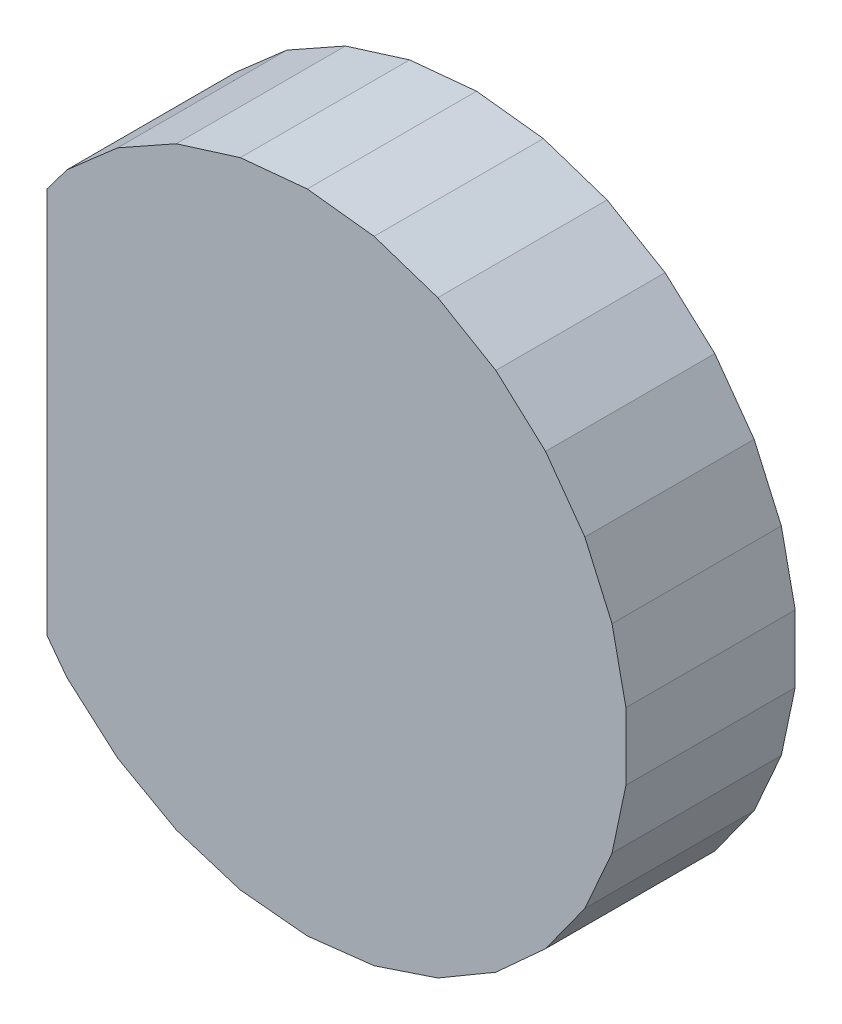
ISO-10303-21;
HEADER;
FILE_DESCRIPTION(('STEP AP214'),'2;1');
FILE_NAME('part.step','',(''),(''),'','','');
FILE_SCHEMA(('AUTOMOTIVE_DESIGN { 1 0 10303 214 1 1 1 1 }'));
ENDSEC;
DATA;
#1=APPLICATION_CONTEXT('core data for automotive mechanical design processes');
#2=APPLICATION_PROTOCOL_DEFINITION('international standard','automotive_design',2000,#1);
#3=PRODUCT_CONTEXT('',#1,'mechanical');
#4=PRODUCT('Part','Part','',(#3));
#5=PRODUCT_RELATED_PRODUCT_CATEGORY('part','',(#4));
#6=PRODUCT_DEFINITION_FORMATION('','',#4);
#7=PRODUCT_DEFINITION_CONTEXT('part definition',#1,'design');
#8=PRODUCT_DEFINITION('design','',#6,#7);
#9=PRODUCT_DEFINITION_SHAPE('','',#8);
#10=(LENGTH_UNIT() NAMED_UNIT(*) SI_UNIT(.MILLI.,.METRE.));
#11=(NAMED_UNIT(*) PLANE_ANGLE_UNIT() SI_UNIT($,.RADIAN.));
#12=(NAMED_UNIT(*) SI_UNIT($,.STERADIAN.) SOLID_ANGLE_UNIT());
#13=UNCERTAINTY_MEASURE_WITH_UNIT(LENGTH_MEASURE(1.E-05),#10,'distance_accuracy_value','');
#14=(GEOMETRIC_REPRESENTATION_CONTEXT(3) GLOBAL_UNCERTAINTY_ASSIGNED_CONTEXT((#13)) GLOBAL_UNIT_ASSIGNED_CONTEXT((#10,
#11,#12)) REPRESENTATION_CONTEXT('',''));
#15=CARTESIAN_POINT('',(0.,0.,0.));
#16=DIRECTION('',(0.,0.,1.));
#17=DIRECTION('',(1.,0.,0.));
#18=AXIS2_PLACEMENT_3D('',#15,#16,#17);
#19=CARTESIAN_POINT('',(-1.71040552,1.14030506,0.));
#20=DIRECTION('',(0.,0.,1.));
#21=DIRECTION('',(1.,0.,0.));
#22=AXIS2_PLACEMENT_3D('',#19,#20,#21);
#23=PLANE('',#22);
#24=DIRECTION('',(-0.752382492689387,-0.658726487014531,0.));
#25=VECTOR('',#24,1.);
#26=CARTESIAN_POINT('',(-1.29253488,1.56069538,0.));
#27=LINE('',#26,#25);
#28=CARTESIAN_POINT('',(-1.29253488000005,1.56069538000006,0.));
#29=VERTEX_POINT('',#28);
#30=CARTESIAN_POINT('',(-1.59128460000002,1.29913380000002,0.));
#31=VERTEX_POINT('',#30);
#32=EDGE_CURVE('E225',#29,#31,#27,.T.);
#33=ORIENTED_EDGE('',*,*,#32,.F.);
#34=DIRECTION('',(-0.87228427335059,-0.488999127264285,0.));
#35=VECTOR('',#34,1.);
#36=CARTESIAN_POINT('',(-0.9461754,1.75486314,0.));
#37=LINE('',#36,#35);
#38=CARTESIAN_POINT('',(-0.946175399999972,1.75486313999995,0.));
#39=VERTEX_POINT('',#38);
#40=EDGE_CURVE('E242',#39,#29,#37,.T.);
#41=ORIENTED_EDGE('',*,*,#40,.F.);
#42=DIRECTION('',(-0.954513322004114,-0.298168271478825,0.));
#43=VECTOR('',#42,1.);
#44=CARTESIAN_POINT('',(-0.56716422,1.87325762,0.));
#45=LINE('',#44,#43);
#46=CARTESIAN_POINT('',(-0.567164220000007,1.87325762000003,0.));
#47=VERTEX_POINT('',#46);
#48=EDGE_CURVE('E252',#47,#39,#45,.T.);
#49=ORIENTED_EDGE('',*,*,#48,.F.);
#50=DIRECTION('',(-0.995529047310377,-0.094455894264432,0.));
#51=VECTOR('',#50,1.);
#52=CARTESIAN_POINT('',(-0.1718691,1.91076326,0.));
#53=LINE('',#52,#51);
#54=CARTESIAN_POINT('',(-0.171869100000002,1.91076326000001,0.));
#55=VERTEX_POINT('',#54);
#56=EDGE_CURVE('E261',#55,#47,#53,.T.);
#57=ORIENTED_EDGE('',*,*,#56,.F.);
#58=DIRECTION('',(-0.993557082385679,0.11333280214156,0.));
#59=VECTOR('',#58,1.);
#60=CARTESIAN_POINT('',(0.2226437,1.86576208,0.));
#61=LINE('',#60,#59);
#62=CARTESIAN_POINT('',(0.222643699999995,1.86576207999995,0.));
#63=VERTEX_POINT('',#62);
#64=EDGE_CURVE('E270',#63,#55,#61,.T.);
#65=ORIENTED_EDGE('',*,*,#64,.F.);
#66=DIRECTION('',(-0.948683937728652,0.316225846975954,0.));
#67=VECTOR('',#66,1.);
#68=CARTESIAN_POINT('',(0.59934094,1.74019718,0.));
#69=LINE('',#68,#67);
#70=CARTESIAN_POINT('',(0.599340940000005,1.74019718000001,0.));
#71=VERTEX_POINT('',#70);
#72=EDGE_CURVE('E279',#71,#63,#69,.T.);
#73=ORIENTED_EDGE('',*,*,#72,.F.);
#74=DIRECTION('',(-0.862846136287346,0.505466660714629,0.));
#75=VECTOR('',#74,1.);
#76=CARTESIAN_POINT('',(0.94195138,1.53949146,0.));
#77=LINE('',#76,#75);
#78=CARTESIAN_POINT('',(0.941951379999965,1.53949145999994,0.));
#79=VERTEX_POINT('',#78);
#80=EDGE_CURVE('E288',#79,#71,#77,.T.);
#81=ORIENTED_EDGE('',*,*,#80,.F.);
#82=DIRECTION('',(-0.739749006902297,0.672882907188959,0.));
#83=VECTOR('',#82,1.);
#84=CARTESIAN_POINT('',(1.2356846,1.27230886,0.));
#85=LINE('',#84,#83);
#86=CARTESIAN_POINT('',(1.23568459999998,1.27230885999998,0.));
#87=VERTEX_POINT('',#86);
#88=EDGE_CURVE('E297',#87,#79,#85,.T.);
#89=ORIENTED_EDGE('',*,*,#88,.F.);
#90=DIRECTION('',(-0.584707403923419,0.811244261487953,0.));
#91=VECTOR('',#90,1.);
#92=CARTESIAN_POINT('',(1.46785584,0.95018606,0.));
#93=LINE('',#92,#91);
#94=CARTESIAN_POINT('',(1.46785583999996,0.950186059999972,0.));
#95=VERTEX_POINT('',#94);
#96=EDGE_CURVE('E306',#95,#87,#93,.T.);
#97=ORIENTED_EDGE('',*,*,#96,.F.);
#98=DIRECTION('',(-0.404425452591693,0.914570966790442,0.));
#99=VECTOR('',#98,1.);
#100=CARTESIAN_POINT('',(1.62844226,0.58703464,0.));
#101=LINE('',#100,#99);
#102=CARTESIAN_POINT('',(1.62844226000006,0.587034640000025,0.));
#103=VERTEX_POINT('',#102);
#104=EDGE_CURVE('E315',#103,#95,#101,.T.);
#105=ORIENTED_EDGE('',*,*,#104,.F.);
#106=DIRECTION('',(-0.20667551822932,0.978409541125107,0.));
#107=VECTOR('',#106,1.);
#108=CARTESIAN_POINT('',(1.71050712,0.19853656,0.));
#109=LINE('',#108,#107);
#110=CARTESIAN_POINT('',(1.71050711999996,0.198536559999995,0.));
#111=VERTEX_POINT('',#110);
#112=EDGE_CURVE('E324',#111,#103,#109,.T.);
#113=ORIENTED_EDGE('',*,*,#112,.F.);
#114=DIRECTION('',(0.,1.,0.));
#115=VECTOR('',#114,1.);
#116=CARTESIAN_POINT('',(1.71050712,1.14030506,0.));
#117=LINE('',#116,#115);
#118=CARTESIAN_POINT('',(1.71050712,-0.198534020000001,0.));
#119=VERTEX_POINT('',#118);
#120=EDGE_CURVE('E333',#119,#111,#117,.T.);
#121=ORIENTED_EDGE('',*,*,#120,.F.);
#122=DIRECTION('',(0.20667551822932,0.978409541125107,0.));
#123=VECTOR('',#122,1.);
#124=CARTESIAN_POINT('',(1.62844226,-0.5870321,0.));
#125=LINE('',#124,#123);
#126=CARTESIAN_POINT('',(1.62844226000004,-0.587032100000009,0.));
#127=VERTEX_POINT('',#126);
#128=EDGE_CURVE('E342',#127,#119,#125,.T.);
#129=ORIENTED_EDGE('',*,*,#128,.F.);
#130=DIRECTION('',(0.404425452591693,0.914570966790442,0.));
#131=VECTOR('',#130,1.);
#132=CARTESIAN_POINT('',(1.46785584,-0.95018352,0.));
#133=LINE('',#132,#131);
#134=CARTESIAN_POINT('',(1.46785583999994,-0.950183519999977,0.));
#135=VERTEX_POINT('',#134);
#136=EDGE_CURVE('E351',#135,#127,#133,.T.);
#137=ORIENTED_EDGE('',*,*,#136,.F.);
#138=DIRECTION('',(0.584707403923419,0.811244261487954,0.));
#139=VECTOR('',#138,1.);
#140=CARTESIAN_POINT('',(1.2356846,-1.27230632,0.));
#141=LINE('',#140,#139);
#142=CARTESIAN_POINT('',(1.23568460000004,-1.27230632000003,0.));
#143=VERTEX_POINT('',#142);
#144=EDGE_CURVE('E360',#143,#135,#141,.T.);
#145=ORIENTED_EDGE('',*,*,#144,.F.);
#146=DIRECTION('',(0.739749006902297,0.672882907188959,0.));
#147=VECTOR('',#146,1.);
#148=CARTESIAN_POINT('',(0.94195138,-1.53948892,0.));
#149=LINE('',#148,#147);
#150=CARTESIAN_POINT('',(0.941951380000022,-1.53948892000002,0.));
#151=VERTEX_POINT('',#150);
#152=EDGE_CURVE('E369',#151,#143,#149,.T.);
#153=ORIENTED_EDGE('',*,*,#152,.F.);
#154=DIRECTION('',(0.862846136287347,0.505466660714629,0.));
#155=VECTOR('',#154,1.);
#156=CARTESIAN_POINT('',(0.59934094,-1.74019464,0.));
#157=LINE('',#156,#155);
#158=CARTESIAN_POINT('',(0.599340940000032,-1.74019464000006,0.));
#159=VERTEX_POINT('',#158);
#160=EDGE_CURVE('E378',#159,#151,#157,.T.);
#161=ORIENTED_EDGE('',*,*,#160,.F.);
#162=DIRECTION('',(0.948683937728651,0.316225846975956,0.));
#163=VECTOR('',#162,1.);
#164=CARTESIAN_POINT('',(0.2226437,-1.86575954,0.));
#165=LINE('',#164,#163);
#166=CARTESIAN_POINT('',(0.222643699999997,-1.86575953999999,0.));
#167=VERTEX_POINT('',#166);
#168=EDGE_CURVE('E387',#167,#159,#165,.T.);
#169=ORIENTED_EDGE('',*,*,#168,.F.);
#170=DIRECTION('',(0.993557082385679,0.11333280214156,0.));
#171=VECTOR('',#170,1.);
#172=CARTESIAN_POINT('',(-0.1718691,-1.91076072,0.));
#173=LINE('',#172,#171);
#174=CARTESIAN_POINT('',(-0.171869099999995,-1.91076072000005,0.));
#175=VERTEX_POINT('',#174);
#176=EDGE_CURVE('E396',#175,#167,#173,.T.);
#177=ORIENTED_EDGE('',*,*,#176,.F.);
#178=DIRECTION('',(0.995529047310377,-0.0944558942644315,0.));
#179=VECTOR('',#178,1.);
#180=CARTESIAN_POINT('',(-0.56716422,-1.87325508,0.));
#181=LINE('',#180,#179);
#182=CARTESIAN_POINT('',(-0.567164219999998,-1.87325507999999,0.));
#183=VERTEX_POINT('',#182);
#184=EDGE_CURVE('E405',#183,#175,#181,.T.);
#185=ORIENTED_EDGE('',*,*,#184,.F.);
#186=DIRECTION('',(0.954513322004114,-0.298168271478826,0.));
#187=VECTOR('',#186,1.);
#188=CARTESIAN_POINT('',(-0.9461754,-1.7548606,0.));
#189=LINE('',#188,#187);
#190=CARTESIAN_POINT('',(-0.946175399999991,-1.75486059999997,0.));
#191=VERTEX_POINT('',#190);
#192=EDGE_CURVE('E213',#191,#183,#189,.T.);
#193=ORIENTED_EDGE('',*,*,#192,.F.);
#194=DIRECTION('',(0.87228427335059,-0.488999127264285,0.));
#195=VECTOR('',#194,1.);
#196=CARTESIAN_POINT('',(-1.29253488,-1.56069284,0.));
#197=LINE('',#196,#195);
#198=CARTESIAN_POINT('',(-1.29253488000003,-1.56069284000005,0.));
#199=VERTEX_POINT('',#198);
#200=EDGE_CURVE('E211',#199,#191,#197,.T.);
#201=ORIENTED_EDGE('',*,*,#200,.F.);
#202=DIRECTION('',(0.752382492689387,-0.65872648701453,0.));
#203=VECTOR('',#202,1.);
#204=CARTESIAN_POINT('',(-1.5912846,-1.29913126,0.));
#205=LINE('',#204,#203);
#206=CARTESIAN_POINT('',(-1.59128459999995,-1.29913125999994,0.));
#207=VERTEX_POINT('',#206);
#208=EDGE_CURVE('E198',#207,#199,#205,.T.);
#209=ORIENTED_EDGE('',*,*,#208,.F.);
#210=DIRECTION('',(0.599997953009411,-0.80000153523885,0.));
#211=VECTOR('',#210,1.);
#212=CARTESIAN_POINT('',(-1.71040552,-1.14030252,0.));
#213=LINE('',#212,#211);
#214=CARTESIAN_POINT('',(-1.71045631999998,-1.14015011999999,0.));
#215=VERTEX_POINT('',#214);
#216=EDGE_CURVE('E187',#215,#207,#213,.T.);
#217=ORIENTED_EDGE('',*,*,#216,.F.);
#218=DIRECTION('',(-4.4555486571318E-05,-0.999999999007404,0.));
#219=VECTOR('',#218,1.);
#220=CARTESIAN_POINT('',(-1.71050712,-1.13999772,0.));
#221=LINE('',#220,#219);
#222=CARTESIAN_POINT('',(-1.71040552,1.14030506,0.));
#223=VERTEX_POINT('',#222);
#224=EDGE_CURVE('E220',#223,#215,#221,.T.);
#225=ORIENTED_EDGE('',*,*,#224,.F.);
#226=DIRECTION('',(-0.599997953009412,-0.800001535238849,0.));
#227=VECTOR('',#226,1.);
#228=CARTESIAN_POINT('',(-1.5912846,1.2991338,0.));
#229=LINE('',#228,#227);
#230=EDGE_CURVE('E221',#31,#223,#229,.T.);
#231=ORIENTED_EDGE('',*,*,#230,.F.);
#232=EDGE_LOOP('',(#33,#41,#49,#57,#65,#73,#81,#89,#97,#105,#113,#121,#129,#137,#145,#153,#161,
#169,#177,#185,#193,#201,#209,#217,#225,#231));
#233=FACE_BOUND('',#232,.T.);
#234=ADVANCED_FACE('F17',(#233),#23,.F.);
#235=CARTESIAN_POINT('',(-1.71050712,-1.13999772,0.));
#236=DIRECTION('',(-0.999999999007404,4.4555486571318E-05,0.));
#237=DIRECTION('',(-4.4555486571318E-05,-0.999999999007404,0.));
#238=AXIS2_PLACEMENT_3D('',#235,#236,#237);
#239=PLANE('',#238);
#240=DIRECTION('',(0.,0.,1.));
#241=VECTOR('',#240,1.);
#242=CARTESIAN_POINT('',(-1.71040552,1.14030506,0.));
#243=LINE('',#242,#241);
#244=CARTESIAN_POINT('',(-1.71040552,1.14030506,1.00000054));
#245=VERTEX_POINT('',#244);
#246=EDGE_CURVE('E238',#223,#245,#243,.T.);
#247=ORIENTED_EDGE('',*,*,#246,.F.);
#248=ORIENTED_EDGE('',*,*,#224,.T.);
#249=DIRECTION('',(0.,0.,-1.));
#250=VECTOR('',#249,1.);
#251=CARTESIAN_POINT('',(-1.71050712754425,-1.14016704255201,0.));
#252=LINE('',#251,#250);
#253=CARTESIAN_POINT('',(-1.71045631999998,-1.14015011999999,1.00000054));
#254=VERTEX_POINT('',#253);
#255=EDGE_CURVE('E193',#254,#215,#252,.T.);
#256=ORIENTED_EDGE('',*,*,#255,.F.);
#257=DIRECTION('',(-4.45554865740698E-05,-0.999999999007404,0.));
#258=VECTOR('',#257,1.);
#259=CARTESIAN_POINT('',(-1.71040552,1.14030506,1.00000054));
#260=LINE('',#259,#258);
#261=EDGE_CURVE('E237',#245,#254,#260,.T.);
#262=ORIENTED_EDGE('',*,*,#261,.F.);
#263=EDGE_LOOP('',(#247,#248,#256,#262));
#264=FACE_BOUND('',#263,.T.);
#265=ADVANCED_FACE('F808',(#264),#239,.T.);
#266=CARTESIAN_POINT('',(-1.5912846,-1.29913126,0.));
#267=DIRECTION('',(-0.800001535239101,-0.599997953009076,0.));
#268=DIRECTION('',(0.599997953009076,-0.800001535239101,0.));
#269=AXIS2_PLACEMENT_3D('',#266,#267,#268);
#270=PLANE('',#269);
#271=ORIENTED_EDGE('',*,*,#255,.T.);
#272=ORIENTED_EDGE('',*,*,#216,.T.);
#273=DIRECTION('',(0.,0.,1.));
#274=VECTOR('',#273,1.);
#275=CARTESIAN_POINT('',(-1.59128459999984,-1.29913125999982,0.));
#276=LINE('',#275,#274);
#277=CARTESIAN_POINT('',(-1.59128459999995,-1.29913125999994,1.00000054));
#278=VERTEX_POINT('',#277);
#279=EDGE_CURVE('E191',#278,#207,#276,.F.);
#280=ORIENTED_EDGE('',*,*,#279,.F.);
#281=DIRECTION('',(0.599997953009411,-0.80000153523885,0.));
#282=VECTOR('',#281,1.);
#283=CARTESIAN_POINT('',(-1.71040552,-1.14030252,1.00000054));
#284=LINE('',#283,#282);
#285=EDGE_CURVE('E442',#254,#278,#284,.T.);
#286=ORIENTED_EDGE('',*,*,#285,.F.);
#287=EDGE_LOOP('',(#271,#272,#280,#286));
#288=FACE_BOUND('',#287,.T.);
#289=ADVANCED_FACE('F189',(#288),#270,.T.);
#290=CARTESIAN_POINT('',(-1.29253488,-1.56069284,0.));
#291=DIRECTION('',(-0.658726487014988,-0.752382492688986,0.));
#292=DIRECTION('',(0.752382492688986,-0.658726487014988,0.));
#293=AXIS2_PLACEMENT_3D('',#290,#291,#292);
#294=PLANE('',#293);
#295=ORIENTED_EDGE('',*,*,#279,.T.);
#296=ORIENTED_EDGE('',*,*,#208,.T.);
#297=DIRECTION('',(0.,0.,1.));
#298=VECTOR('',#297,1.);
#299=CARTESIAN_POINT('',(-1.29253488000009,-1.56069284000016,0.));
#300=LINE('',#299,#298);
#301=CARTESIAN_POINT('',(-1.29253488000002,-1.56069284000004,1.00000054));
#302=VERTEX_POINT('',#301);
#303=EDGE_CURVE('E206',#302,#199,#300,.F.);
#304=ORIENTED_EDGE('',*,*,#303,.F.);
#305=DIRECTION('',(0.752382492689387,-0.65872648701453,0.));
#306=VECTOR('',#305,1.);
#307=CARTESIAN_POINT('',(-1.5912846,-1.29913126,1.00000054));
#308=LINE('',#307,#306);
#309=EDGE_CURVE('E204',#278,#302,#308,.T.);
#310=ORIENTED_EDGE('',*,*,#309,.F.);
#311=EDGE_LOOP('',(#295,#296,#304,#310));
#312=FACE_BOUND('',#311,.T.);
#313=ADVANCED_FACE('F201',(#312),#294,.T.);
#314=CARTESIAN_POINT('',(-0.9461754,-1.7548606,0.));
#315=DIRECTION('',(-0.488999127263893,-0.87228427335081,0.));
#316=DIRECTION('',(0.87228427335081,-0.488999127263893,0.));
#317=AXIS2_PLACEMENT_3D('',#314,#315,#316);
#318=PLANE('',#317);
#319=ORIENTED_EDGE('',*,*,#303,.T.);
#320=ORIENTED_EDGE('',*,*,#200,.T.);
#321=DIRECTION('',(0.,0.,1.));
#322=VECTOR('',#321,1.);
#323=CARTESIAN_POINT('',(-0.946175399999976,-1.75486059999992,0.));
#324=LINE('',#323,#322);
#325=CARTESIAN_POINT('',(-0.946175399999994,-1.75486059999998,1.00000054));
#326=VERTEX_POINT('',#325);
#327=EDGE_CURVE('E418',#326,#191,#324,.F.);
#328=ORIENTED_EDGE('',*,*,#327,.F.);
#329=DIRECTION('',(0.87228427335059,-0.488999127264285,0.));
#330=VECTOR('',#329,1.);
#331=CARTESIAN_POINT('',(-1.29253488,-1.56069284,1.00000054));
#332=LINE('',#331,#330);
#333=EDGE_CURVE('E433',#302,#326,#332,.T.);
#334=ORIENTED_EDGE('',*,*,#333,.F.);
#335=EDGE_LOOP('',(#319,#320,#328,#334));
#336=FACE_BOUND('',#335,.T.);
#337=ADVANCED_FACE('F431',(#336),#318,.T.);
#338=CARTESIAN_POINT('',(-0.56716422,-1.87325508,0.));
#339=DIRECTION('',(-0.298168271479017,-0.954513322004054,0.));
#340=DIRECTION('',(0.954513322004054,-0.298168271479017,0.));
#341=AXIS2_PLACEMENT_3D('',#338,#339,#340);
#342=PLANE('',#341);
#343=ORIENTED_EDGE('',*,*,#327,.T.);
#344=ORIENTED_EDGE('',*,*,#192,.T.);
#345=DIRECTION('',(0.,0.,1.));
#346=VECTOR('',#345,1.);
#347=CARTESIAN_POINT('',(-0.567164219999997,-1.87325507999996,0.));
#348=LINE('',#347,#346);
#349=CARTESIAN_POINT('',(-0.567164219999999,-1.87325507999999,1.00000054));
#350=VERTEX_POINT('',#349);
#351=EDGE_CURVE('E410',#350,#183,#348,.F.);
#352=ORIENTED_EDGE('',*,*,#351,.F.);
#353=DIRECTION('',(0.954513322004114,-0.298168271478826,0.));
#354=VECTOR('',#353,1.);
#355=CARTESIAN_POINT('',(-0.9461754,-1.7548606,1.00000054));
#356=LINE('',#355,#354);
#357=EDGE_CURVE('E437',#326,#350,#356,.T.);
#358=ORIENTED_EDGE('',*,*,#357,.F.);
#359=EDGE_LOOP('',(#343,#344,#352,#358));
#360=FACE_BOUND('',#359,.T.);
#361=ADVANCED_FACE('F523',(#360),#342,.T.);
#362=CARTESIAN_POINT('',(-0.1718691,-1.91076072,0.));
#363=DIRECTION('',(-0.0944558942645249,-0.995529047310368,0.));
#364=DIRECTION('',(0.995529047310368,-0.0944558942645249,0.));
#365=AXIS2_PLACEMENT_3D('',#362,#363,#364);
#366=PLANE('',#365);
#367=ORIENTED_EDGE('',*,*,#351,.T.);
#368=ORIENTED_EDGE('',*,*,#184,.T.);
#369=DIRECTION('',(0.,0.,1.));
#370=VECTOR('',#369,1.);
#371=CARTESIAN_POINT('',(-0.171869099999982,-1.91076072000016,0.));
#372=LINE('',#371,#370);
#373=CARTESIAN_POINT('',(-0.171869099999996,-1.91076072000004,1.00000054));
#374=VERTEX_POINT('',#373);
#375=EDGE_CURVE('E401',#374,#175,#372,.F.);
#376=ORIENTED_EDGE('',*,*,#375,.F.);
#377=DIRECTION('',(0.995529047310377,-0.0944558942644315,0.));
#378=VECTOR('',#377,1.);
#379=CARTESIAN_POINT('',(-0.56716422,-1.87325508,1.00000054));
#380=LINE('',#379,#378);
#381=EDGE_CURVE('E516',#350,#374,#380,.T.);
#382=ORIENTED_EDGE('',*,*,#381,.F.);
#383=EDGE_LOOP('',(#367,#368,#376,#382));
#384=FACE_BOUND('',#383,.T.);
#385=ADVANCED_FACE('F526',(#384),#366,.T.);
#386=CARTESIAN_POINT('',(0.2226437,-1.86575954,0.));
#387=DIRECTION('',(0.113332802141958,-0.993557082385633,0.));
#388=DIRECTION('',(0.993557082385633,0.113332802141958,0.));
#389=AXIS2_PLACEMENT_3D('',#386,#387,#388);
#390=PLANE('',#389);
#391=ORIENTED_EDGE('',*,*,#375,.T.);
#392=ORIENTED_EDGE('',*,*,#176,.T.);
#393=DIRECTION('',(0.,0.,1.));
#394=VECTOR('',#393,1.);
#395=CARTESIAN_POINT('',(0.222643699999992,-1.86575953999997,0.));
#396=LINE('',#395,#394);
#397=CARTESIAN_POINT('',(0.222643699999998,-1.86575953999999,1.00000054));
#398=VERTEX_POINT('',#397);
#399=EDGE_CURVE('E392',#398,#167,#396,.F.);
#400=ORIENTED_EDGE('',*,*,#399,.F.);
#401=DIRECTION('',(0.993557082385679,0.11333280214156,0.));
#402=VECTOR('',#401,1.);
#403=CARTESIAN_POINT('',(-0.1718691,-1.91076072,1.00000054));
#404=LINE('',#403,#402);
#405=EDGE_CURVE('E513',#374,#398,#404,.T.);
#406=ORIENTED_EDGE('',*,*,#405,.F.);
#407=EDGE_LOOP('',(#391,#392,#400,#406));
#408=FACE_BOUND('',#407,.T.);
#409=ADVANCED_FACE('F530',(#408),#390,.T.);
#410=CARTESIAN_POINT('',(0.59934094,-1.74019464,0.));
#411=DIRECTION('',(0.316225846975891,-0.948683937728673,0.));
#412=DIRECTION('',(0.948683937728673,0.316225846975891,0.));
#413=AXIS2_PLACEMENT_3D('',#410,#411,#412);
#414=PLANE('',#413);
#415=ORIENTED_EDGE('',*,*,#399,.T.);
#416=ORIENTED_EDGE('',*,*,#168,.T.);
#417=DIRECTION('',(0.,0.,1.));
#418=VECTOR('',#417,1.);
#419=CARTESIAN_POINT('',(0.599340940000099,-1.74019464000017,0.));
#420=LINE('',#419,#418);
#421=CARTESIAN_POINT('',(0.599340940000024,-1.74019464000004,1.00000054));
#422=VERTEX_POINT('',#421);
#423=EDGE_CURVE('E383',#422,#159,#420,.F.);
#424=ORIENTED_EDGE('',*,*,#423,.F.);
#425=DIRECTION('',(0.948683937728651,0.316225846975956,0.));
#426=VECTOR('',#425,1.);
#427=CARTESIAN_POINT('',(0.2226437,-1.86575954,1.00000054));
#428=LINE('',#427,#426);
#429=EDGE_CURVE('E510',#398,#422,#428,.T.);
#430=ORIENTED_EDGE('',*,*,#429,.F.);
#431=EDGE_LOOP('',(#415,#416,#424,#430));
#432=FACE_BOUND('',#431,.T.);
#433=ADVANCED_FACE('F534',(#432),#414,.T.);
#434=CARTESIAN_POINT('',(0.94195138,-1.53948892,0.));
#435=DIRECTION('',(0.505466660715056,-0.862846136287096,0.));
#436=DIRECTION('',(0.862846136287096,0.505466660715056,0.));
#437=AXIS2_PLACEMENT_3D('',#434,#435,#436);
#438=PLANE('',#437);
#439=ORIENTED_EDGE('',*,*,#423,.T.);
#440=ORIENTED_EDGE('',*,*,#160,.T.);
#441=DIRECTION('',(0.,0.,1.));
#442=VECTOR('',#441,1.);
#443=CARTESIAN_POINT('',(0.941951380000062,-1.53948892000007,0.));
#444=LINE('',#443,#442);
#445=CARTESIAN_POINT('',(0.941951380000016,-1.53948892000002,1.00000054));
#446=VERTEX_POINT('',#445);
#447=EDGE_CURVE('E374',#446,#151,#444,.F.);
#448=ORIENTED_EDGE('',*,*,#447,.F.);
#449=DIRECTION('',(0.862846136287347,0.505466660714629,0.));
#450=VECTOR('',#449,1.);
#451=CARTESIAN_POINT('',(0.59934094,-1.74019464,1.00000054));
#452=LINE('',#451,#450);
#453=EDGE_CURVE('E507',#422,#446,#452,.T.);
#454=ORIENTED_EDGE('',*,*,#453,.F.);
#455=EDGE_LOOP('',(#439,#440,#448,#454));
#456=FACE_BOUND('',#455,.T.);
#457=ADVANCED_FACE('F538',(#456),#438,.T.);
#458=CARTESIAN_POINT('',(1.2356846,-1.27230632,0.));
#459=DIRECTION('',(0.672882907189129,-0.739749006902142,0.));
#460=DIRECTION('',(0.739749006902142,0.672882907189129,0.));
#461=AXIS2_PLACEMENT_3D('',#458,#459,#460);
#462=PLANE('',#461);
#463=ORIENTED_EDGE('',*,*,#447,.T.);
#464=ORIENTED_EDGE('',*,*,#152,.T.);
#465=DIRECTION('',(0.,0.,1.));
#466=VECTOR('',#465,1.);
#467=CARTESIAN_POINT('',(1.23568460000012,-1.27230632000009,0.));
#468=LINE('',#467,#466);
#469=CARTESIAN_POINT('',(1.23568460000003,-1.27230632000002,1.00000054));
#470=VERTEX_POINT('',#469);
#471=EDGE_CURVE('E365',#470,#143,#468,.F.);
#472=ORIENTED_EDGE('',*,*,#471,.F.);
#473=DIRECTION('',(0.739749006902297,0.672882907188959,0.));
#474=VECTOR('',#473,1.);
#475=CARTESIAN_POINT('',(0.94195138,-1.53948892,1.00000054));
#476=LINE('',#475,#474);
#477=EDGE_CURVE('E504',#446,#470,#476,.T.);
#478=ORIENTED_EDGE('',*,*,#477,.F.);
#479=EDGE_LOOP('',(#463,#464,#472,#478));
#480=FACE_BOUND('',#479,.T.);
#481=ADVANCED_FACE('F542',(#480),#462,.T.);
#482=CARTESIAN_POINT('',(1.46785584,-0.95018352,0.));
#483=DIRECTION('',(0.811244261488168,-0.584707403923121,0.));
#484=DIRECTION('',(0.584707403923121,0.811244261488168,0.));
#485=AXIS2_PLACEMENT_3D('',#482,#483,#484);
#486=PLANE('',#485);
#487=ORIENTED_EDGE('',*,*,#471,.T.);
#488=ORIENTED_EDGE('',*,*,#144,.T.);
#489=DIRECTION('',(0.,0.,1.));
#490=VECTOR('',#489,1.);
#491=CARTESIAN_POINT('',(1.46785583999983,-0.950183519999926,0.));
#492=LINE('',#491,#490);
#493=CARTESIAN_POINT('',(1.46785583999996,-0.950183519999982,1.00000054));
#494=VERTEX_POINT('',#493);
#495=EDGE_CURVE('E356',#494,#135,#492,.F.);
#496=ORIENTED_EDGE('',*,*,#495,.F.);
#497=DIRECTION('',(0.584707403923419,0.811244261487954,0.));
#498=VECTOR('',#497,1.);
#499=CARTESIAN_POINT('',(1.2356846,-1.27230632,1.00000054));
#500=LINE('',#499,#498);
#501=EDGE_CURVE('E501',#470,#494,#500,.T.);
#502=ORIENTED_EDGE('',*,*,#501,.F.);
#503=EDGE_LOOP('',(#487,#488,#496,#502));
#504=FACE_BOUND('',#503,.T.);
#505=ADVANCED_FACE('F546',(#504),#486,.T.);
#506=CARTESIAN_POINT('',(1.62844226,-0.5870321,0.));
#507=DIRECTION('',(0.914570966790256,-0.404425452592113,0.));
#508=DIRECTION('',(0.404425452592113,0.914570966790256,0.));
#509=AXIS2_PLACEMENT_3D('',#506,#507,#508);
#510=PLANE('',#509);
#511=ORIENTED_EDGE('',*,*,#495,.T.);
#512=ORIENTED_EDGE('',*,*,#136,.T.);
#513=DIRECTION('',(0.,0.,1.));
#514=VECTOR('',#513,1.);
#515=CARTESIAN_POINT('',(1.62844226000011,-0.587032100000024,0.));
#516=LINE('',#515,#514);
#517=CARTESIAN_POINT('',(1.62844226000003,-0.587032100000006,1.00000054));
#518=VERTEX_POINT('',#517);
#519=EDGE_CURVE('E347',#518,#127,#516,.F.);
#520=ORIENTED_EDGE('',*,*,#519,.F.);
#521=DIRECTION('',(0.404425452591693,0.914570966790442,0.));
#522=VECTOR('',#521,1.);
#523=CARTESIAN_POINT('',(1.46785584,-0.95018352,1.00000054));
#524=LINE('',#523,#522);
#525=EDGE_CURVE('E498',#494,#518,#524,.T.);
#526=ORIENTED_EDGE('',*,*,#525,.F.);
#527=EDGE_LOOP('',(#511,#512,#520,#526));
#528=FACE_BOUND('',#527,.T.);
#529=ADVANCED_FACE('F550',(#528),#510,.T.);
#530=CARTESIAN_POINT('',(1.71050712,-0.19853402,0.));
#531=DIRECTION('',(0.978409541125167,-0.206675518229035,0.));
#532=DIRECTION('',(0.206675518229035,0.978409541125167,0.));
#533=AXIS2_PLACEMENT_3D('',#530,#531,#532);
#534=PLANE('',#533);
#535=ORIENTED_EDGE('',*,*,#519,.T.);
#536=ORIENTED_EDGE('',*,*,#128,.T.);
#537=DIRECTION('',(0.,0.,-1.));
#538=VECTOR('',#537,1.);
#539=CARTESIAN_POINT('',(1.71050712,-0.19853402,0.));
#540=LINE('',#539,#538);
#541=CARTESIAN_POINT('',(1.71050712,-0.19853402,1.00000054));
#542=VERTEX_POINT('',#541);
#543=EDGE_CURVE('E338',#542,#119,#540,.T.);
#544=ORIENTED_EDGE('',*,*,#543,.F.);
#545=DIRECTION('',(0.20667551822932,0.978409541125107,0.));
#546=VECTOR('',#545,1.);
#547=CARTESIAN_POINT('',(1.62844226,-0.5870321,1.00000054));
#548=LINE('',#547,#546);
#549=EDGE_CURVE('E495',#518,#542,#548,.T.);
#550=ORIENTED_EDGE('',*,*,#549,.F.);
#551=EDGE_LOOP('',(#535,#536,#544,#550));
#552=FACE_BOUND('',#551,.T.);
#553=ADVANCED_FACE('F554',(#552),#534,.T.);
#554=CARTESIAN_POINT('',(1.71050712,0.19853656,0.));
#555=DIRECTION('',(1.,0.,0.));
#556=DIRECTION('',(0.,0.,-1.));
#557=AXIS2_PLACEMENT_3D('',#554,#555,#556);
#558=PLANE('',#557);
#559=ORIENTED_EDGE('',*,*,#543,.T.);
#560=ORIENTED_EDGE('',*,*,#120,.T.);
#561=DIRECTION('',(0.,0.,1.));
#562=VECTOR('',#561,1.);
#563=CARTESIAN_POINT('',(1.71050711999989,0.198536559999976,0.));
#564=LINE('',#563,#562);
#565=CARTESIAN_POINT('',(1.71050711999997,0.198536559999995,1.00000054));
#566=VERTEX_POINT('',#565);
#567=EDGE_CURVE('E329',#566,#111,#564,.F.);
#568=ORIENTED_EDGE('',*,*,#567,.F.);
#569=DIRECTION('',(0.,1.,0.));
#570=VECTOR('',#569,1.);
#571=CARTESIAN_POINT('',(1.71050712,1.14030506,1.00000054));
#572=LINE('',#571,#570);
#573=EDGE_CURVE('E492',#542,#566,#572,.T.);
#574=ORIENTED_EDGE('',*,*,#573,.F.);
#575=EDGE_LOOP('',(#559,#560,#568,#574));
#576=FACE_BOUND('',#575,.T.);
#577=ADVANCED_FACE('F558',(#576),#558,.T.);
#578=CARTESIAN_POINT('',(1.62844226,0.58703464,0.));
#579=DIRECTION('',(0.978409541125167,0.206675518229035,0.));
#580=DIRECTION('',(-0.206675518229035,0.978409541125167,0.));
#581=AXIS2_PLACEMENT_3D('',#578,#579,#580);
#582=PLANE('',#581);
#583=ORIENTED_EDGE('',*,*,#567,.T.);
#584=ORIENTED_EDGE('',*,*,#112,.T.);
#585=DIRECTION('',(0.,0.,1.));
#586=VECTOR('',#585,1.);
#587=CARTESIAN_POINT('',(1.62844226000017,0.587034640000074,0.));
#588=LINE('',#587,#586);
#589=CARTESIAN_POINT('',(1.62844226000004,0.587034640000018,1.00000054));
#590=VERTEX_POINT('',#589);
#591=EDGE_CURVE('E320',#590,#103,#588,.F.);
#592=ORIENTED_EDGE('',*,*,#591,.F.);
#593=DIRECTION('',(-0.20667551822932,0.978409541125107,0.));
#594=VECTOR('',#593,1.);
#595=CARTESIAN_POINT('',(1.71050712,0.19853656,1.00000054));
#596=LINE('',#595,#594);
#597=EDGE_CURVE('E489',#566,#590,#596,.T.);
#598=ORIENTED_EDGE('',*,*,#597,.F.);
#599=EDGE_LOOP('',(#583,#584,#592,#598));
#600=FACE_BOUND('',#599,.T.);
#601=ADVANCED_FACE('F562',(#600),#582,.T.);
#602=CARTESIAN_POINT('',(1.46785584,0.95018606,0.));
#603=DIRECTION('',(0.914570966790256,0.404425452592113,0.));
#604=DIRECTION('',(-0.404425452592113,0.914570966790256,0.));
#605=AXIS2_PLACEMENT_3D('',#602,#603,#604);
#606=PLANE('',#605);
#607=ORIENTED_EDGE('',*,*,#591,.T.);
#608=ORIENTED_EDGE('',*,*,#104,.T.);
#609=DIRECTION('',(0.,0.,1.));
#610=VECTOR('',#609,1.);
#611=CARTESIAN_POINT('',(1.46785583999988,0.950186059999915,0.));
#612=LINE('',#611,#610);
#613=CARTESIAN_POINT('',(1.46785583999997,0.950186059999979,1.00000054));
#614=VERTEX_POINT('',#613);
#615=EDGE_CURVE('E311',#614,#95,#612,.F.);
#616=ORIENTED_EDGE('',*,*,#615,.F.);
#617=DIRECTION('',(-0.404425452591693,0.914570966790442,0.));
#618=VECTOR('',#617,1.);
#619=CARTESIAN_POINT('',(1.62844226,0.58703464,1.00000054));
#620=LINE('',#619,#618);
#621=EDGE_CURVE('E486',#590,#614,#620,.T.);
#622=ORIENTED_EDGE('',*,*,#621,.F.);
#623=EDGE_LOOP('',(#607,#608,#616,#622));
#624=FACE_BOUND('',#623,.T.);
#625=ADVANCED_FACE('F566',(#624),#606,.T.);
#626=CARTESIAN_POINT('',(1.2356846,1.27230886,0.));
#627=DIRECTION('',(0.811244261488168,0.584707403923121,0.));
#628=DIRECTION('',(-0.584707403923121,0.811244261488168,0.));
#629=AXIS2_PLACEMENT_3D('',#626,#627,#628);
#630=PLANE('',#629);
#631=ORIENTED_EDGE('',*,*,#615,.T.);
#632=ORIENTED_EDGE('',*,*,#96,.T.);
#633=DIRECTION('',(0.,0.,1.));
#634=VECTOR('',#633,1.);
#635=CARTESIAN_POINT('',(1.23568459999994,1.27230885999993,0.));
#636=LINE('',#635,#634);
#637=CARTESIAN_POINT('',(1.23568459999998,1.27230885999998,1.00000054));
#638=VERTEX_POINT('',#637);
#639=EDGE_CURVE('E302',#638,#87,#636,.F.);
#640=ORIENTED_EDGE('',*,*,#639,.F.);
#641=DIRECTION('',(-0.584707403923419,0.811244261487953,0.));
#642=VECTOR('',#641,1.);
#643=CARTESIAN_POINT('',(1.46785584,0.95018606,1.00000054));
#644=LINE('',#643,#642);
#645=EDGE_CURVE('E483',#614,#638,#644,.T.);
#646=ORIENTED_EDGE('',*,*,#645,.F.);
#647=EDGE_LOOP('',(#631,#632,#640,#646));
#648=FACE_BOUND('',#647,.T.);
#649=ADVANCED_FACE('F570',(#648),#630,.T.);
#650=CARTESIAN_POINT('',(0.94195138,1.53949146,0.));
#651=DIRECTION('',(0.672882907189129,0.739749006902142,0.));
#652=DIRECTION('',(-0.739749006902142,0.672882907189129,0.));
#653=AXIS2_PLACEMENT_3D('',#650,#651,#652);
#654=PLANE('',#653);
#655=ORIENTED_EDGE('',*,*,#639,.T.);
#656=ORIENTED_EDGE('',*,*,#88,.T.);
#657=DIRECTION('',(0.,0.,1.));
#658=VECTOR('',#657,1.);
#659=CARTESIAN_POINT('',(0.941951379999901,1.53949145999983,0.));
#660=LINE('',#659,#658);
#661=CARTESIAN_POINT('',(0.941951379999975,1.53949145999996,1.00000054));
#662=VERTEX_POINT('',#661);
#663=EDGE_CURVE('E293',#662,#79,#660,.F.);
#664=ORIENTED_EDGE('',*,*,#663,.F.);
#665=DIRECTION('',(-0.739749006902297,0.672882907188959,0.));
#666=VECTOR('',#665,1.);
#667=CARTESIAN_POINT('',(1.2356846,1.27230886,1.00000054));
#668=LINE('',#667,#666);
#669=EDGE_CURVE('E480',#638,#662,#668,.T.);
#670=ORIENTED_EDGE('',*,*,#669,.F.);
#671=EDGE_LOOP('',(#655,#656,#664,#670));
#672=FACE_BOUND('',#671,.T.);
#673=ADVANCED_FACE('F574',(#672),#654,.T.);
#674=CARTESIAN_POINT('',(0.59934094,1.74019718,0.));
#675=DIRECTION('',(0.505466660715056,0.862846136287096,0.));
#676=DIRECTION('',(-0.862846136287096,0.505466660715056,0.));
#677=AXIS2_PLACEMENT_3D('',#674,#675,#676);
#678=PLANE('',#677);
#679=ORIENTED_EDGE('',*,*,#663,.T.);
#680=ORIENTED_EDGE('',*,*,#80,.T.);
#681=DIRECTION('',(0.,0.,1.));
#682=VECTOR('',#681,1.);
#683=CARTESIAN_POINT('',(0.599340940000008,1.74019718000003,0.));
#684=LINE('',#683,#682);
#685=CARTESIAN_POINT('',(0.599340940000003,1.74019718000001,1.00000054));
#686=VERTEX_POINT('',#685);
#687=EDGE_CURVE('E284',#686,#71,#684,.F.);
#688=ORIENTED_EDGE('',*,*,#687,.F.);
#689=DIRECTION('',(-0.862846136287346,0.505466660714629,0.));
#690=VECTOR('',#689,1.);
#691=CARTESIAN_POINT('',(0.94195138,1.53949146,1.00000054));
#692=LINE('',#691,#690);
#693=EDGE_CURVE('E477',#662,#686,#692,.T.);
#694=ORIENTED_EDGE('',*,*,#693,.F.);
#695=EDGE_LOOP('',(#679,#680,#688,#694));
#696=FACE_BOUND('',#695,.T.);
#697=ADVANCED_FACE('F578',(#696),#678,.T.);
#698=CARTESIAN_POINT('',(0.2226437,1.86576208,0.));
#699=DIRECTION('',(0.316225846975891,0.948683937728673,0.));
#700=DIRECTION('',(-0.948683937728673,0.316225846975891,0.));
#701=AXIS2_PLACEMENT_3D('',#698,#699,#700);
#702=PLANE('',#701);
#703=ORIENTED_EDGE('',*,*,#687,.T.);
#704=ORIENTED_EDGE('',*,*,#72,.T.);
#705=DIRECTION('',(0.,0.,1.));
#706=VECTOR('',#705,1.);
#707=CARTESIAN_POINT('',(0.222643699999982,1.86576207999984,0.));
#708=LINE('',#707,#706);
#709=CARTESIAN_POINT('',(0.222643699999996,1.86576207999996,1.00000054));
#710=VERTEX_POINT('',#709);
#711=EDGE_CURVE('E275',#710,#63,#708,.F.);
#712=ORIENTED_EDGE('',*,*,#711,.F.);
#713=DIRECTION('',(-0.948683937728652,0.316225846975954,0.));
#714=VECTOR('',#713,1.);
#715=CARTESIAN_POINT('',(0.59934094,1.74019718,1.00000054));
#716=LINE('',#715,#714);
#717=EDGE_CURVE('E474',#686,#710,#716,.T.);
#718=ORIENTED_EDGE('',*,*,#717,.F.);
#719=EDGE_LOOP('',(#703,#704,#712,#718));
#720=FACE_BOUND('',#719,.T.);
#721=ADVANCED_FACE('F582',(#720),#702,.T.);
#722=CARTESIAN_POINT('',(-0.1718691,1.91076326,0.));
#723=DIRECTION('',(0.113332802141958,0.993557082385633,0.));
#724=DIRECTION('',(-0.993557082385633,0.113332802141958,0.));
#725=AXIS2_PLACEMENT_3D('',#722,#723,#724);
#726=PLANE('',#725);
#727=ORIENTED_EDGE('',*,*,#711,.T.);
#728=ORIENTED_EDGE('',*,*,#64,.T.);
#729=DIRECTION('',(0.,0.,1.));
#730=VECTOR('',#729,1.);
#731=CARTESIAN_POINT('',(-0.171869100000002,1.91076326000002,0.));
#732=LINE('',#731,#730);
#733=CARTESIAN_POINT('',(-0.171869100000001,1.91076326000001,1.00000054));
#734=VERTEX_POINT('',#733);
#735=EDGE_CURVE('E266',#734,#55,#732,.F.);
#736=ORIENTED_EDGE('',*,*,#735,.F.);
#737=DIRECTION('',(-0.993557082385679,0.11333280214156,0.));
#738=VECTOR('',#737,1.);
#739=CARTESIAN_POINT('',(0.2226437,1.86576208,1.00000054));
#740=LINE('',#739,#738);
#741=EDGE_CURVE('E471',#710,#734,#740,.T.);
#742=ORIENTED_EDGE('',*,*,#741,.F.);
#743=EDGE_LOOP('',(#727,#728,#736,#742));
#744=FACE_BOUND('',#743,.T.);
#745=ADVANCED_FACE('F586',(#744),#726,.T.);
#746=CARTESIAN_POINT('',(-0.56716422,1.87325762,0.));
#747=DIRECTION('',(-0.0944558942644853,0.995529047310372,0.));
#748=DIRECTION('',(-0.995529047310372,-0.0944558942644853,0.));
#749=AXIS2_PLACEMENT_3D('',#746,#747,#748);
#750=PLANE('',#749);
#751=ORIENTED_EDGE('',*,*,#735,.T.);
#752=ORIENTED_EDGE('',*,*,#56,.T.);
#753=DIRECTION('',(0.,0.,1.));
#754=VECTOR('',#753,1.);
#755=CARTESIAN_POINT('',(-0.567164220000024,1.87325762000008,0.));
#756=LINE('',#755,#754);
#757=CARTESIAN_POINT('',(-0.567164220000006,1.87325762000002,1.00000054));
#758=VERTEX_POINT('',#757);
#759=EDGE_CURVE('E257',#758,#47,#756,.F.);
#760=ORIENTED_EDGE('',*,*,#759,.F.);
#761=DIRECTION('',(-0.995529047310377,-0.094455894264432,0.));
#762=VECTOR('',#761,1.);
#763=CARTESIAN_POINT('',(-0.1718691,1.91076326,1.00000054));
#764=LINE('',#763,#762);
#765=EDGE_CURVE('E468',#734,#758,#764,.T.);
#766=ORIENTED_EDGE('',*,*,#765,.F.);
#767=EDGE_LOOP('',(#751,#752,#760,#766));
#768=FACE_BOUND('',#767,.T.);
#769=ADVANCED_FACE('F590',(#768),#750,.T.);
#770=CARTESIAN_POINT('',(-0.9461754,1.75486314,0.));
#771=DIRECTION('',(-0.298168271479017,0.954513322004054,0.));
#772=DIRECTION('',(-0.954513322004054,-0.298168271479017,0.));
#773=AXIS2_PLACEMENT_3D('',#770,#771,#772);
#774=PLANE('',#773);
#775=ORIENTED_EDGE('',*,*,#759,.T.);
#776=ORIENTED_EDGE('',*,*,#48,.T.);
#777=DIRECTION('',(0.,0.,1.));
#778=VECTOR('',#777,1.);
#779=CARTESIAN_POINT('',(-0.946175399999913,1.75486313999984,0.));
#780=LINE('',#779,#778);
#781=CARTESIAN_POINT('',(-0.946175399999978,1.75486313999996,1.00000054));
#782=VERTEX_POINT('',#781);
#783=EDGE_CURVE('E248',#782,#39,#780,.F.);
#784=ORIENTED_EDGE('',*,*,#783,.F.);
#785=DIRECTION('',(-0.954513322004114,-0.298168271478825,0.));
#786=VECTOR('',#785,1.);
#787=CARTESIAN_POINT('',(-0.56716422,1.87325762,1.00000054));
#788=LINE('',#787,#786);
#789=EDGE_CURVE('E464',#758,#782,#788,.T.);
#790=ORIENTED_EDGE('',*,*,#789,.F.);
#791=EDGE_LOOP('',(#775,#776,#784,#790));
#792=FACE_BOUND('',#791,.T.);
#793=ADVANCED_FACE('F593',(#792),#774,.T.);
#794=CARTESIAN_POINT('',(-1.29253488,1.56069538,0.));
#795=DIRECTION('',(-0.488999127263893,0.87228427335081,0.));
#796=DIRECTION('',(-0.87228427335081,-0.488999127263893,0.));
#797=AXIS2_PLACEMENT_3D('',#794,#795,#796);
#798=PLANE('',#797);
#799=ORIENTED_EDGE('',*,*,#783,.T.);
#800=ORIENTED_EDGE('',*,*,#40,.T.);
#801=DIRECTION('',(0.,0.,1.));
#802=VECTOR('',#801,1.);
#803=CARTESIAN_POINT('',(-1.29253488000016,1.56069538000018,0.));
#804=LINE('',#803,#802);
#805=CARTESIAN_POINT('',(-1.29253488000004,1.56069538000005,1.00000054));
#806=VERTEX_POINT('',#805);
#807=EDGE_CURVE('E245',#806,#29,#804,.F.);
#808=ORIENTED_EDGE('',*,*,#807,.F.);
#809=DIRECTION('',(-0.87228427335059,-0.488999127264285,0.));
#810=VECTOR('',#809,1.);
#811=CARTESIAN_POINT('',(-0.9461754,1.75486314,1.00000054));
#812=LINE('',#811,#810);
#813=EDGE_CURVE('E462',#782,#806,#812,.T.);
#814=ORIENTED_EDGE('',*,*,#813,.F.);
#815=EDGE_LOOP('',(#799,#800,#808,#814));
#816=FACE_BOUND('',#815,.T.);
#817=ADVANCED_FACE('F597',(#816),#798,.T.);
#818=CARTESIAN_POINT('',(-1.5912846,1.2991338,0.));
#819=DIRECTION('',(-0.658726487014988,0.752382492688986,0.));
#820=DIRECTION('',(-0.752382492688986,-0.658726487014988,0.));
#821=AXIS2_PLACEMENT_3D('',#818,#819,#820);
#822=PLANE('',#821);
#823=ORIENTED_EDGE('',*,*,#807,.T.);
#824=ORIENTED_EDGE('',*,*,#32,.T.);
#825=DIRECTION('',(0.,0.,1.));
#826=VECTOR('',#825,1.);
#827=CARTESIAN_POINT('',(-1.59128460000007,1.29913380000005,0.));
#828=LINE('',#827,#826);
#829=CARTESIAN_POINT('',(-1.59128460000002,1.29913380000001,1.00000054));
#830=VERTEX_POINT('',#829);
#831=EDGE_CURVE('E35',#830,#31,#828,.F.);
#832=ORIENTED_EDGE('',*,*,#831,.F.);
#833=DIRECTION('',(-0.752382492689387,-0.658726487014531,0.));
#834=VECTOR('',#833,1.);
#835=CARTESIAN_POINT('',(-1.29253488,1.56069538,1.00000054));
#836=LINE('',#835,#834);
#837=EDGE_CURVE('E26',#806,#830,#836,.T.);
#838=ORIENTED_EDGE('',*,*,#837,.F.);
#839=EDGE_LOOP('',(#823,#824,#832,#838));
#840=FACE_BOUND('',#839,.T.);
#841=ADVANCED_FACE('F598',(#840),#822,.T.);
#842=CARTESIAN_POINT('',(-1.71040552,1.14030506,0.));
#843=DIRECTION('',(-0.800001535239101,0.599997953009076,0.));
#844=DIRECTION('',(-0.599997953009076,-0.800001535239101,0.));
#845=AXIS2_PLACEMENT_3D('',#842,#843,#844);
#846=PLANE('',#845);
#847=ORIENTED_EDGE('',*,*,#831,.T.);
#848=ORIENTED_EDGE('',*,*,#230,.T.);
#849=ORIENTED_EDGE('',*,*,#246,.T.);
#850=DIRECTION('',(-0.599997953009412,-0.800001535238849,0.));
#851=VECTOR('',#850,1.);
#852=CARTESIAN_POINT('',(-1.5912846,1.2991338,1.00000054));
#853=LINE('',#852,#851);
#854=EDGE_CURVE('E11',#830,#245,#853,.T.);
#855=ORIENTED_EDGE('',*,*,#854,.F.);
#856=EDGE_LOOP('',(#847,#848,#849,#855));
#857=FACE_BOUND('',#856,.T.);
#858=ADVANCED_FACE('F457',(#857),#846,.T.);
#859=CARTESIAN_POINT('',(-1.71040552,1.14030506,1.00000054));
#860=DIRECTION('',(0.,0.,1.));
#861=DIRECTION('',(1.,0.,0.));
#862=AXIS2_PLACEMENT_3D('',#859,#860,#861);
#863=PLANE('',#862);
#864=ORIENTED_EDGE('',*,*,#837,.T.);
#865=ORIENTED_EDGE('',*,*,#854,.T.);
#866=ORIENTED_EDGE('',*,*,#261,.T.);
#867=ORIENTED_EDGE('',*,*,#285,.T.);
#868=ORIENTED_EDGE('',*,*,#309,.T.);
#869=ORIENTED_EDGE('',*,*,#333,.T.);
#870=ORIENTED_EDGE('',*,*,#357,.T.);
#871=ORIENTED_EDGE('',*,*,#381,.T.);
#872=ORIENTED_EDGE('',*,*,#405,.T.);
#873=ORIENTED_EDGE('',*,*,#429,.T.);
#874=ORIENTED_EDGE('',*,*,#453,.T.);
#875=ORIENTED_EDGE('',*,*,#477,.T.);
#876=ORIENTED_EDGE('',*,*,#501,.T.);
#877=ORIENTED_EDGE('',*,*,#525,.T.);
#878=ORIENTED_EDGE('',*,*,#549,.T.);
#879=ORIENTED_EDGE('',*,*,#573,.T.);
#880=ORIENTED_EDGE('',*,*,#597,.T.);
#881=ORIENTED_EDGE('',*,*,#621,.T.);
#882=ORIENTED_EDGE('',*,*,#645,.T.);
#883=ORIENTED_EDGE('',*,*,#669,.T.);
#884=ORIENTED_EDGE('',*,*,#693,.T.);
#885=ORIENTED_EDGE('',*,*,#717,.T.);
#886=ORIENTED_EDGE('',*,*,#741,.T.);
#887=ORIENTED_EDGE('',*,*,#765,.T.);
#888=ORIENTED_EDGE('',*,*,#789,.T.);
#889=ORIENTED_EDGE('',*,*,#813,.T.);
#890=EDGE_LOOP('',(#864,#865,#866,#867,#868,#869,#870,#871,#872,#873,#874,#875,#876,#877,#878,
#879,#880,#881,#882,#883,#884,#885,#886,#887,#888,#889));
#891=FACE_BOUND('',#890,.T.);
#892=ADVANCED_FACE('F440',(#891),#863,.T.);
#893=CLOSED_SHELL('',(#234,#265,#289,#313,#337,#361,#385,#409,#433,#457,#481,#505,#529,#553,
#577,#601,#625,#649,#673,#697,#721,#745,#769,#793,#817,#841,#858,#892));
#894=MANIFOLD_SOLID_BREP('B1',#893);
#895=ADVANCED_BREP_SHAPE_REPRESENTATION('',(#18,#894),#14);
#896=SHAPE_DEFINITION_REPRESENTATION(#9,#895);
ENDSEC;
END-ISO-10303-21;
